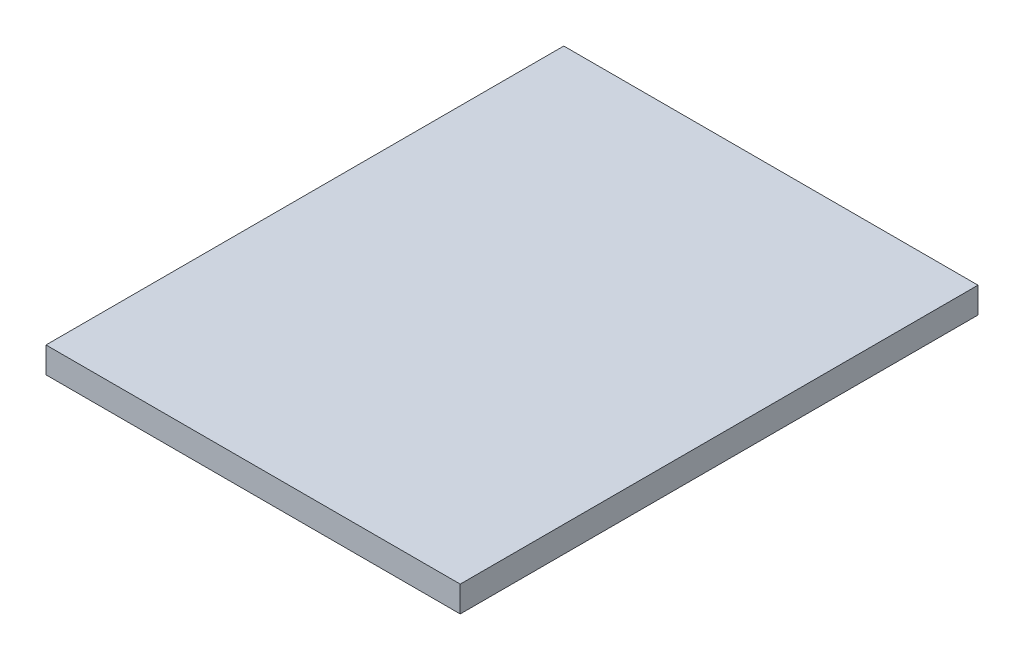
ISO-10303-21;
HEADER;
FILE_DESCRIPTION(('STEP AP214'),'2;1');
FILE_NAME('part.step','',(''),(''),'','','');
FILE_SCHEMA(('AUTOMOTIVE_DESIGN { 1 0 10303 214 1 1 1 1 }'));
ENDSEC;
DATA;
#1=APPLICATION_CONTEXT('core data for automotive mechanical design processes');
#2=APPLICATION_PROTOCOL_DEFINITION('international standard','automotive_design',2000,#1);
#3=PRODUCT_CONTEXT('',#1,'mechanical');
#4=PRODUCT('Part','Part','',(#3));
#5=PRODUCT_RELATED_PRODUCT_CATEGORY('part','',(#4));
#6=PRODUCT_DEFINITION_FORMATION('','',#4);
#7=PRODUCT_DEFINITION_CONTEXT('part definition',#1,'design');
#8=PRODUCT_DEFINITION('design','',#6,#7);
#9=PRODUCT_DEFINITION_SHAPE('','',#8);
#10=(LENGTH_UNIT() NAMED_UNIT(*) SI_UNIT(.MILLI.,.METRE.));
#11=(NAMED_UNIT(*) PLANE_ANGLE_UNIT() SI_UNIT($,.RADIAN.));
#12=(NAMED_UNIT(*) SI_UNIT($,.STERADIAN.) SOLID_ANGLE_UNIT());
#13=UNCERTAINTY_MEASURE_WITH_UNIT(LENGTH_MEASURE(1.E-05),#10,'distance_accuracy_value','');
#14=(GEOMETRIC_REPRESENTATION_CONTEXT(3) GLOBAL_UNCERTAINTY_ASSIGNED_CONTEXT((#13)) GLOBAL_UNIT_ASSIGNED_CONTEXT((#10,
#11,#12)) REPRESENTATION_CONTEXT('',''));
#15=CARTESIAN_POINT('',(0.,0.,0.));
#16=DIRECTION('',(0.,0.,1.));
#17=DIRECTION('',(1.,0.,0.));
#18=AXIS2_PLACEMENT_3D('',#15,#16,#17);
#19=CARTESIAN_POINT('',(0.,2.54,0.));
#20=DIRECTION('',(1.,0.,0.));
#21=DIRECTION('',(0.,0.,-1.));
#22=AXIS2_PLACEMENT_3D('',#19,#20,#21);
#23=PLANE('',#22);
#24=DIRECTION('',(0.,0.,1.));
#25=VECTOR('',#24,1.);
#26=CARTESIAN_POINT('',(0.,0.,0.));
#27=LINE('',#26,#25);
#28=CARTESIAN_POINT('',(0.,0.,-50.8));
#29=VERTEX_POINT('',#28);
#30=CARTESIAN_POINT('',(0.,0.,0.));
#31=VERTEX_POINT('',#30);
#32=EDGE_CURVE('E96',#29,#31,#27,.T.);
#33=ORIENTED_EDGE('',*,*,#32,.T.);
#34=DIRECTION('',(0.,-1.,0.));
#35=VECTOR('',#34,1.);
#36=CARTESIAN_POINT('',(0.,2.54,0.));
#37=LINE('',#36,#35);
#38=CARTESIAN_POINT('',(0.,2.54,0.));
#39=VERTEX_POINT('',#38);
#40=EDGE_CURVE('E11',#39,#31,#37,.T.);
#41=ORIENTED_EDGE('',*,*,#40,.F.);
#42=DIRECTION('',(0.,0.,1.));
#43=VECTOR('',#42,1.);
#44=CARTESIAN_POINT('',(0.,2.54,0.));
#45=LINE('',#44,#43);
#46=CARTESIAN_POINT('',(0.,2.54,-50.8));
#47=VERTEX_POINT('',#46);
#48=EDGE_CURVE('E84',#47,#39,#45,.T.);
#49=ORIENTED_EDGE('',*,*,#48,.F.);
#50=DIRECTION('',(0.,-1.,0.));
#51=VECTOR('',#50,1.);
#52=CARTESIAN_POINT('',(0.,2.54,-50.8));
#53=LINE('',#52,#51);
#54=EDGE_CURVE('E92',#47,#29,#53,.T.);
#55=ORIENTED_EDGE('',*,*,#54,.T.);
#56=EDGE_LOOP('',(#33,#41,#49,#55));
#57=FACE_BOUND('',#56,.T.);
#58=ADVANCED_FACE('F33',(#57),#23,.F.);
#59=CARTESIAN_POINT('',(0.,2.54,0.));
#60=DIRECTION('',(0.,0.,-1.));
#61=DIRECTION('',(-1.,0.,0.));
#62=AXIS2_PLACEMENT_3D('',#59,#60,#61);
#63=PLANE('',#62);
#64=DIRECTION('',(1.,0.,0.));
#65=VECTOR('',#64,1.);
#66=CARTESIAN_POINT('',(0.,0.,0.));
#67=LINE('',#66,#65);
#68=CARTESIAN_POINT('',(40.64,0.,0.));
#69=VERTEX_POINT('',#68);
#70=EDGE_CURVE('E88',#31,#69,#67,.T.);
#71=ORIENTED_EDGE('',*,*,#70,.T.);
#72=DIRECTION('',(0.,-1.,0.));
#73=VECTOR('',#72,1.);
#74=CARTESIAN_POINT('',(40.64,2.54,0.));
#75=LINE('',#74,#73);
#76=CARTESIAN_POINT('',(40.64,2.54,0.));
#77=VERTEX_POINT('',#76);
#78=EDGE_CURVE('E41',#77,#69,#75,.T.);
#79=ORIENTED_EDGE('',*,*,#78,.F.);
#80=DIRECTION('',(1.,0.,0.));
#81=VECTOR('',#80,1.);
#82=CARTESIAN_POINT('',(0.,2.54,0.));
#83=LINE('',#82,#81);
#84=EDGE_CURVE('E79',#39,#77,#83,.T.);
#85=ORIENTED_EDGE('',*,*,#84,.F.);
#86=ORIENTED_EDGE('',*,*,#40,.T.);
#87=EDGE_LOOP('',(#71,#79,#85,#86));
#88=FACE_BOUND('',#87,.T.);
#89=ADVANCED_FACE('F87',(#88),#63,.F.);
#90=CARTESIAN_POINT('',(40.64,2.54,-50.8));
#91=DIRECTION('',(-1.,0.,0.));
#92=DIRECTION('',(0.,0.,1.));
#93=AXIS2_PLACEMENT_3D('',#90,#91,#92);
#94=PLANE('',#93);
#95=DIRECTION('',(0.,0.,-1.));
#96=VECTOR('',#95,1.);
#97=CARTESIAN_POINT('',(40.64,0.,-50.8));
#98=LINE('',#97,#96);
#99=CARTESIAN_POINT('',(40.64,0.,-50.8));
#100=VERTEX_POINT('',#99);
#101=EDGE_CURVE('E66',#69,#100,#98,.T.);
#102=ORIENTED_EDGE('',*,*,#101,.T.);
#103=DIRECTION('',(0.,-1.,0.));
#104=VECTOR('',#103,1.);
#105=CARTESIAN_POINT('',(40.64,2.54,-50.8));
#106=LINE('',#105,#104);
#107=CARTESIAN_POINT('',(40.64,2.54,-50.8));
#108=VERTEX_POINT('',#107);
#109=EDGE_CURVE('E89',#108,#100,#106,.T.);
#110=ORIENTED_EDGE('',*,*,#109,.F.);
#111=DIRECTION('',(0.,0.,-1.));
#112=VECTOR('',#111,1.);
#113=CARTESIAN_POINT('',(40.64,2.54,-50.8));
#114=LINE('',#113,#112);
#115=EDGE_CURVE('E82',#77,#108,#114,.T.);
#116=ORIENTED_EDGE('',*,*,#115,.F.);
#117=ORIENTED_EDGE('',*,*,#78,.T.);
#118=EDGE_LOOP('',(#102,#110,#116,#117));
#119=FACE_BOUND('',#118,.T.);
#120=ADVANCED_FACE('F90',(#119),#94,.F.);
#121=CARTESIAN_POINT('',(0.,2.54,-50.8));
#122=DIRECTION('',(0.,0.,1.));
#123=DIRECTION('',(1.,0.,0.));
#124=AXIS2_PLACEMENT_3D('',#121,#122,#123);
#125=PLANE('',#124);
#126=DIRECTION('',(-1.,0.,0.));
#127=VECTOR('',#126,1.);
#128=CARTESIAN_POINT('',(0.,0.,-50.8));
#129=LINE('',#128,#127);
#130=EDGE_CURVE('E72',#100,#29,#129,.T.);
#131=ORIENTED_EDGE('',*,*,#130,.T.);
#132=ORIENTED_EDGE('',*,*,#54,.F.);
#133=DIRECTION('',(-1.,0.,0.));
#134=VECTOR('',#133,1.);
#135=CARTESIAN_POINT('',(0.,2.54,-50.8));
#136=LINE('',#135,#134);
#137=EDGE_CURVE('E49',#108,#47,#136,.T.);
#138=ORIENTED_EDGE('',*,*,#137,.F.);
#139=ORIENTED_EDGE('',*,*,#109,.T.);
#140=EDGE_LOOP('',(#131,#132,#138,#139));
#141=FACE_BOUND('',#140,.T.);
#142=ADVANCED_FACE('F103',(#141),#125,.F.);
#143=CARTESIAN_POINT('',(0.,2.54,0.));
#144=DIRECTION('',(0.,-1.,0.));
#145=DIRECTION('',(0.,0.,-1.));
#146=AXIS2_PLACEMENT_3D('',#143,#144,#145);
#147=PLANE('',#146);
#148=ORIENTED_EDGE('',*,*,#48,.T.);
#149=ORIENTED_EDGE('',*,*,#84,.T.);
#150=ORIENTED_EDGE('',*,*,#115,.T.);
#151=ORIENTED_EDGE('',*,*,#137,.T.);
#152=EDGE_LOOP('',(#148,#149,#150,#151));
#153=FACE_BOUND('',#152,.T.);
#154=ADVANCED_FACE('F80',(#153),#147,.F.);
#155=CARTESIAN_POINT('',(0.,0.,0.));
#156=DIRECTION('',(0.,-1.,0.));
#157=DIRECTION('',(0.,0.,-1.));
#158=AXIS2_PLACEMENT_3D('',#155,#156,#157);
#159=PLANE('',#158);
#160=ORIENTED_EDGE('',*,*,#32,.F.);
#161=ORIENTED_EDGE('',*,*,#130,.F.);
#162=ORIENTED_EDGE('',*,*,#101,.F.);
#163=ORIENTED_EDGE('',*,*,#70,.F.);
#164=EDGE_LOOP('',(#160,#161,#162,#163));
#165=FACE_BOUND('',#164,.T.);
#166=ADVANCED_FACE('F106',(#165),#159,.T.);
#167=CLOSED_SHELL('',(#58,#89,#120,#142,#154,#166));
#168=MANIFOLD_SOLID_BREP('B2',#167);
#169=ADVANCED_BREP_SHAPE_REPRESENTATION('',(#18,#168),#14);
#170=SHAPE_DEFINITION_REPRESENTATION(#9,#169);
ENDSEC;
END-ISO-10303-21;
